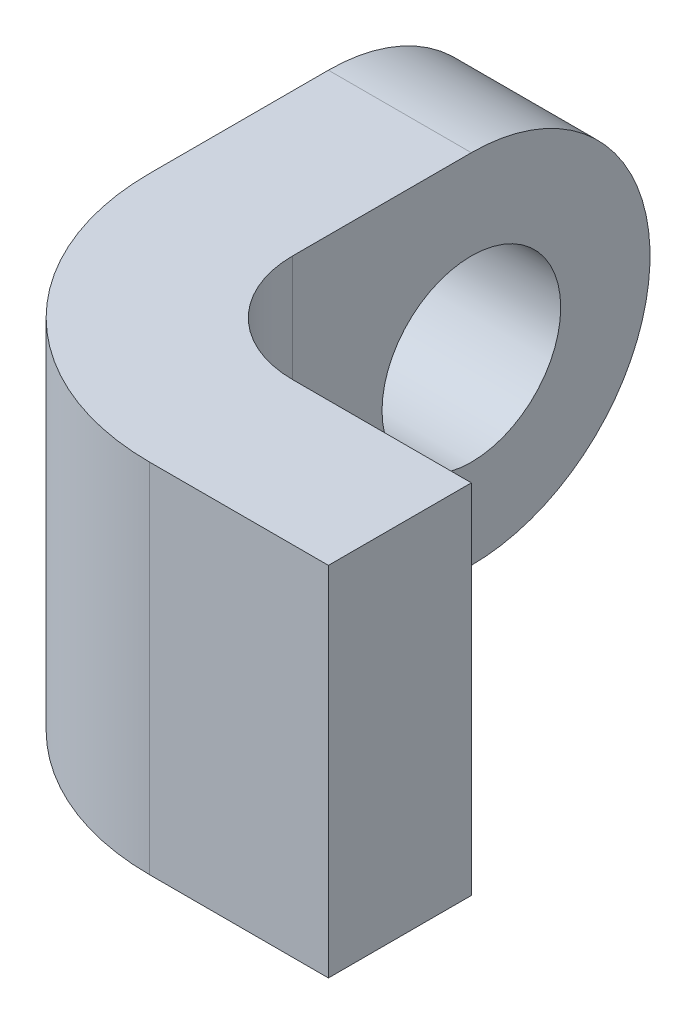
ISO-10303-21;
HEADER;
FILE_DESCRIPTION(('STEP AP214'),'2;1');
FILE_NAME('part.step','',(''),(''),'','','');
FILE_SCHEMA(('AUTOMOTIVE_DESIGN { 1 0 10303 214 1 1 1 1 }'));
ENDSEC;
DATA;
#1=APPLICATION_CONTEXT('core data for automotive mechanical design processes');
#2=APPLICATION_PROTOCOL_DEFINITION('international standard','automotive_design',2000,#1);
#3=PRODUCT_CONTEXT('',#1,'mechanical');
#4=PRODUCT('Part','Part','',(#3));
#5=PRODUCT_RELATED_PRODUCT_CATEGORY('part','',(#4));
#6=PRODUCT_DEFINITION_FORMATION('','',#4);
#7=PRODUCT_DEFINITION_CONTEXT('part definition',#1,'design');
#8=PRODUCT_DEFINITION('design','',#6,#7);
#9=PRODUCT_DEFINITION_SHAPE('','',#8);
#10=(LENGTH_UNIT() NAMED_UNIT(*) SI_UNIT(.MILLI.,.METRE.));
#11=(NAMED_UNIT(*) PLANE_ANGLE_UNIT() SI_UNIT($,.RADIAN.));
#12=(NAMED_UNIT(*) SI_UNIT($,.STERADIAN.) SOLID_ANGLE_UNIT());
#13=UNCERTAINTY_MEASURE_WITH_UNIT(LENGTH_MEASURE(1.E-05),#10,'distance_accuracy_value','');
#14=(GEOMETRIC_REPRESENTATION_CONTEXT(3) GLOBAL_UNCERTAINTY_ASSIGNED_CONTEXT((#13)) GLOBAL_UNIT_ASSIGNED_CONTEXT((#10,
#11,#12)) REPRESENTATION_CONTEXT('',''));
#15=CARTESIAN_POINT('',(0.,0.,0.));
#16=DIRECTION('',(0.,0.,1.));
#17=DIRECTION('',(1.,0.,0.));
#18=AXIS2_PLACEMENT_3D('',#15,#16,#17);
#19=CARTESIAN_POINT('',(-3.75,0.,-0.5));
#20=DIRECTION('',(1.,0.,0.));
#21=DIRECTION('',(0.,1.,0.));
#22=AXIS2_PLACEMENT_3D('',#19,#20,#21);
#23=PLANE('',#22);
#24=DIRECTION('',(0.,1.,0.));
#25=VECTOR('',#24,1.);
#26=CARTESIAN_POINT('',(-3.75,-0.5,-0.7));
#27=LINE('',#26,#25);
#28=CARTESIAN_POINT('',(-3.75,-0.5,-0.7));
#29=VERTEX_POINT('',#28);
#30=CARTESIAN_POINT('',(-3.75,0.5,-0.7));
#31=VERTEX_POINT('',#30);
#32=EDGE_CURVE('E11',#29,#31,#27,.T.);
#33=ORIENTED_EDGE('',*,*,#32,.T.);
#34=DIRECTION('',(0.,0.,1.));
#35=VECTOR('',#34,1.);
#36=CARTESIAN_POINT('',(-3.75,0.5,-0.7));
#37=LINE('',#36,#35);
#38=CARTESIAN_POINT('',(-3.75,0.5,-0.3));
#39=VERTEX_POINT('',#38);
#40=EDGE_CURVE('E180',#31,#39,#37,.T.);
#41=ORIENTED_EDGE('',*,*,#40,.T.);
#42=DIRECTION('',(0.,-1.,0.));
#43=VECTOR('',#42,1.);
#44=CARTESIAN_POINT('',(-3.75,0.5,-0.3));
#45=LINE('',#44,#43);
#46=CARTESIAN_POINT('',(-3.75,-0.5,-0.3));
#47=VERTEX_POINT('',#46);
#48=EDGE_CURVE('E27',#39,#47,#45,.T.);
#49=ORIENTED_EDGE('',*,*,#48,.T.);
#50=DIRECTION('',(0.,0.,-1.));
#51=VECTOR('',#50,1.);
#52=CARTESIAN_POINT('',(-3.75,-0.5,-0.3));
#53=LINE('',#52,#51);
#54=EDGE_CURVE('E196',#47,#29,#53,.T.);
#55=ORIENTED_EDGE('',*,*,#54,.T.);
#56=EDGE_LOOP('',(#33,#41,#49,#55));
#57=FACE_BOUND('',#56,.T.);
#58=ADVANCED_FACE('F16',(#57),#23,.T.);
#59=CARTESIAN_POINT('',(-3.75,-0.5,-0.7));
#60=DIRECTION('',(0.,0.,1.));
#61=DIRECTION('',(1.,0.,0.));
#62=AXIS2_PLACEMENT_3D('',#59,#60,#61);
#63=PLANE('',#62);
#64=ORIENTED_EDGE('',*,*,#32,.F.);
#65=DIRECTION('',(-1.,0.,0.));
#66=VECTOR('',#65,1.);
#67=CARTESIAN_POINT('',(-3.75,-0.5,-0.7));
#68=LINE('',#67,#66);
#69=CARTESIAN_POINT('',(-4.25,-0.5,-0.7));
#70=VERTEX_POINT('',#69);
#71=EDGE_CURVE('E193',#29,#70,#68,.T.);
#72=ORIENTED_EDGE('',*,*,#71,.T.);
#73=DIRECTION('',(0.,1.,0.));
#74=VECTOR('',#73,1.);
#75=CARTESIAN_POINT('',(-4.25,-0.5,-0.7));
#76=LINE('',#75,#74);
#77=CARTESIAN_POINT('',(-4.25,0.5,-0.7));
#78=VERTEX_POINT('',#77);
#79=EDGE_CURVE('E173',#70,#78,#76,.T.);
#80=ORIENTED_EDGE('',*,*,#79,.T.);
#81=DIRECTION('',(-1.,0.,0.));
#82=VECTOR('',#81,1.);
#83=CARTESIAN_POINT('',(-3.75,0.5,-0.7));
#84=LINE('',#83,#82);
#85=EDGE_CURVE('E162',#31,#78,#84,.T.);
#86=ORIENTED_EDGE('',*,*,#85,.F.);
#87=EDGE_LOOP('',(#64,#72,#80,#86));
#88=FACE_BOUND('',#87,.T.);
#89=ADVANCED_FACE('F238',(#88),#63,.F.);
#90=CARTESIAN_POINT('',(-3.75,0.5,-0.3));
#91=DIRECTION('',(0.,0.,-1.));
#92=DIRECTION('',(0.,-1.,0.));
#93=AXIS2_PLACEMENT_3D('',#90,#91,#92);
#94=PLANE('',#93);
#95=ORIENTED_EDGE('',*,*,#48,.F.);
#96=DIRECTION('',(-1.,0.,0.));
#97=VECTOR('',#96,1.);
#98=CARTESIAN_POINT('',(-3.75,0.5,-0.3));
#99=LINE('',#98,#97);
#100=CARTESIAN_POINT('',(-4.25,0.5,-0.3));
#101=VERTEX_POINT('',#100);
#102=EDGE_CURVE('E170',#39,#101,#99,.T.);
#103=ORIENTED_EDGE('',*,*,#102,.T.);
#104=DIRECTION('',(0.,-1.,0.));
#105=VECTOR('',#104,1.);
#106=CARTESIAN_POINT('',(-4.25,0.5,-0.3));
#107=LINE('',#106,#105);
#108=CARTESIAN_POINT('',(-4.25,-0.5,-0.3));
#109=VERTEX_POINT('',#108);
#110=EDGE_CURVE('E153',#101,#109,#107,.T.);
#111=ORIENTED_EDGE('',*,*,#110,.T.);
#112=DIRECTION('',(-1.,0.,0.));
#113=VECTOR('',#112,1.);
#114=CARTESIAN_POINT('',(-3.75,-0.5,-0.3));
#115=LINE('',#114,#113);
#116=EDGE_CURVE('E183',#47,#109,#115,.T.);
#117=ORIENTED_EDGE('',*,*,#116,.F.);
#118=EDGE_LOOP('',(#95,#103,#111,#117));
#119=FACE_BOUND('',#118,.T.);
#120=ADVANCED_FACE('F227',(#119),#94,.F.);
#121=CARTESIAN_POINT('',(-3.75,-0.5,-0.3));
#122=DIRECTION('',(0.,1.,0.));
#123=DIRECTION('',(1.,0.,0.));
#124=AXIS2_PLACEMENT_3D('',#121,#122,#123);
#125=PLANE('',#124);
#126=DIRECTION('',(1.,0.,0.));
#127=VECTOR('',#126,1.);
#128=CARTESIAN_POINT('',(-4.25,-0.5,-1.5));
#129=LINE('',#128,#127);
#130=CARTESIAN_POINT('',(-4.95,-0.5,-1.5));
#131=VERTEX_POINT('',#130);
#132=CARTESIAN_POINT('',(-4.55,-0.5,-1.5));
#133=VERTEX_POINT('',#132);
#134=EDGE_CURVE('E119',#131,#133,#129,.T.);
#135=ORIENTED_EDGE('',*,*,#134,.T.);
#136=DIRECTION('',(0.,0.,-1.));
#137=VECTOR('',#136,1.);
#138=CARTESIAN_POINT('',(-4.55,-0.5,-1.));
#139=LINE('',#138,#137);
#140=CARTESIAN_POINT('',(-4.55,-0.5,-1.));
#141=VERTEX_POINT('',#140);
#142=EDGE_CURVE('E156',#141,#133,#139,.T.);
#143=ORIENTED_EDGE('',*,*,#142,.F.);
#144=CARTESIAN_POINT('',(-4.25,-0.5,-1.));
#145=DIRECTION('',(0.,-1.,0.));
#146=DIRECTION('',(0.,0.,1.));
#147=AXIS2_PLACEMENT_3D('',#144,#145,#146);
#148=CIRCLE('',#147,0.3);
#149=EDGE_CURVE('E197',#70,#141,#148,.T.);
#150=ORIENTED_EDGE('',*,*,#149,.F.);
#151=ORIENTED_EDGE('',*,*,#71,.F.);
#152=ORIENTED_EDGE('',*,*,#54,.F.);
#153=ORIENTED_EDGE('',*,*,#116,.T.);
#154=CARTESIAN_POINT('',(-4.25,-0.5,-1.));
#155=DIRECTION('',(0.,-1.,0.));
#156=DIRECTION('',(0.,0.,1.));
#157=AXIS2_PLACEMENT_3D('',#154,#155,#156);
#158=CIRCLE('',#157,0.7);
#159=CARTESIAN_POINT('',(-4.95,-0.5,-1.));
#160=VERTEX_POINT('',#159);
#161=EDGE_CURVE('E110',#109,#160,#158,.T.);
#162=ORIENTED_EDGE('',*,*,#161,.T.);
#163=DIRECTION('',(0.,0.,-1.));
#164=VECTOR('',#163,1.);
#165=CARTESIAN_POINT('',(-4.95,-0.5,-1.));
#166=LINE('',#165,#164);
#167=EDGE_CURVE('E131',#160,#131,#166,.T.);
#168=ORIENTED_EDGE('',*,*,#167,.T.);
#169=EDGE_LOOP('',(#135,#143,#150,#151,#152,#153,#162,#168));
#170=FACE_BOUND('',#169,.T.);
#171=ADVANCED_FACE('F132',(#170),#125,.F.);
#172=CARTESIAN_POINT('',(-4.25,0.,-1.));
#173=DIRECTION('',(0.,-1.,0.));
#174=DIRECTION('',(0.,0.,1.));
#175=AXIS2_PLACEMENT_3D('',#172,#173,#174);
#176=CYLINDRICAL_SURFACE('',#175,0.3);
#177=ORIENTED_EDGE('',*,*,#79,.F.);
#178=ORIENTED_EDGE('',*,*,#149,.T.);
#179=DIRECTION('',(0.,1.,0.));
#180=VECTOR('',#179,1.);
#181=CARTESIAN_POINT('',(-4.55,-0.5,-1.));
#182=LINE('',#181,#180);
#183=CARTESIAN_POINT('',(-4.55,0.5,-1.));
#184=VERTEX_POINT('',#183);
#185=EDGE_CURVE('E174',#141,#184,#182,.T.);
#186=ORIENTED_EDGE('',*,*,#185,.T.);
#187=CARTESIAN_POINT('',(-4.25,0.5,-1.));
#188=DIRECTION('',(0.,-1.,0.));
#189=DIRECTION('',(0.,0.,1.));
#190=AXIS2_PLACEMENT_3D('',#187,#188,#189);
#191=CIRCLE('',#190,0.3);
#192=EDGE_CURVE('E157',#78,#184,#191,.T.);
#193=ORIENTED_EDGE('',*,*,#192,.F.);
#194=EDGE_LOOP('',(#177,#178,#186,#193));
#195=FACE_BOUND('',#194,.T.);
#196=ADVANCED_FACE('F290',(#195),#176,.F.);
#197=CARTESIAN_POINT('',(-4.25,0.,-1.));
#198=DIRECTION('',(0.,-1.,0.));
#199=DIRECTION('',(0.,0.,1.));
#200=AXIS2_PLACEMENT_3D('',#197,#198,#199);
#201=CYLINDRICAL_SURFACE('',#200,0.7);
#202=ORIENTED_EDGE('',*,*,#110,.F.);
#203=CARTESIAN_POINT('',(-4.25,0.5,-1.));
#204=DIRECTION('',(0.,-1.,0.));
#205=DIRECTION('',(0.,0.,1.));
#206=AXIS2_PLACEMENT_3D('',#203,#204,#205);
#207=CIRCLE('',#206,0.7);
#208=CARTESIAN_POINT('',(-4.95,0.5,-1.));
#209=VERTEX_POINT('',#208);
#210=EDGE_CURVE('E128',#101,#209,#207,.T.);
#211=ORIENTED_EDGE('',*,*,#210,.T.);
#212=DIRECTION('',(0.,-1.,0.));
#213=VECTOR('',#212,1.);
#214=CARTESIAN_POINT('',(-4.95,0.5,-1.));
#215=LINE('',#214,#213);
#216=EDGE_CURVE('E136',#209,#160,#215,.T.);
#217=ORIENTED_EDGE('',*,*,#216,.T.);
#218=ORIENTED_EDGE('',*,*,#161,.F.);
#219=EDGE_LOOP('',(#202,#211,#217,#218));
#220=FACE_BOUND('',#219,.T.);
#221=ADVANCED_FACE('F226',(#220),#201,.T.);
#222=CARTESIAN_POINT('',(-4.55,-0.5,-1.));
#223=DIRECTION('',(-1.,0.,0.));
#224=DIRECTION('',(0.,0.,1.));
#225=AXIS2_PLACEMENT_3D('',#222,#223,#224);
#226=PLANE('',#225);
#227=CARTESIAN_POINT('',(-4.55,0.,-1.5));
#228=DIRECTION('',(-1.,0.,0.));
#229=DIRECTION('',(0.,0.,-1.));
#230=AXIS2_PLACEMENT_3D('',#227,#228,#229);
#231=CIRCLE('',#230,0.25);
#232=CARTESIAN_POINT('',(-4.55,0.,-1.25));
#233=VERTEX_POINT('',#232);
#234=EDGE_CURVE('E142',#233,#233,#231,.T.);
#235=ORIENTED_EDGE('',*,*,#234,.T.);
#236=EDGE_LOOP('',(#235));
#237=FACE_BOUND('',#236,.T.);
#238=CARTESIAN_POINT('',(-4.55,0.,-1.5));
#239=DIRECTION('',(1.,0.,0.));
#240=DIRECTION('',(0.,0.707106781186548,-0.707106781186547));
#241=AXIS2_PLACEMENT_3D('',#238,#239,#240);
#242=CIRCLE('',#241,0.5);
#243=CARTESIAN_POINT('',(-4.55,0.5,-1.5));
#244=VERTEX_POINT('',#243);
#245=EDGE_CURVE('E125',#133,#244,#242,.T.);
#246=ORIENTED_EDGE('',*,*,#245,.T.);
#247=DIRECTION('',(0.,0.,-1.));
#248=VECTOR('',#247,1.);
#249=CARTESIAN_POINT('',(-4.55,0.5,-1.));
#250=LINE('',#249,#248);
#251=EDGE_CURVE('E161',#184,#244,#250,.T.);
#252=ORIENTED_EDGE('',*,*,#251,.F.);
#253=ORIENTED_EDGE('',*,*,#185,.F.);
#254=ORIENTED_EDGE('',*,*,#142,.T.);
#255=EDGE_LOOP('',(#246,#252,#253,#254));
#256=FACE_BOUND('',#255,.T.);
#257=ADVANCED_FACE('F274',(#237,#256),#226,.F.);
#258=CARTESIAN_POINT('',(-3.75,0.5,-0.7));
#259=DIRECTION('',(0.,-1.,0.));
#260=DIRECTION('',(0.,0.,-1.));
#261=AXIS2_PLACEMENT_3D('',#258,#259,#260);
#262=PLANE('',#261);
#263=DIRECTION('',(-1.,0.,0.));
#264=VECTOR('',#263,1.);
#265=CARTESIAN_POINT('',(-4.25,0.5,-1.5));
#266=LINE('',#265,#264);
#267=CARTESIAN_POINT('',(-4.95,0.5,-1.5));
#268=VERTEX_POINT('',#267);
#269=EDGE_CURVE('E20',#244,#268,#266,.T.);
#270=ORIENTED_EDGE('',*,*,#269,.T.);
#271=DIRECTION('',(0.,0.,-1.));
#272=VECTOR('',#271,1.);
#273=CARTESIAN_POINT('',(-4.95,0.5,-1.));
#274=LINE('',#273,#272);
#275=EDGE_CURVE('E140',#209,#268,#274,.T.);
#276=ORIENTED_EDGE('',*,*,#275,.F.);
#277=ORIENTED_EDGE('',*,*,#210,.F.);
#278=ORIENTED_EDGE('',*,*,#102,.F.);
#279=ORIENTED_EDGE('',*,*,#40,.F.);
#280=ORIENTED_EDGE('',*,*,#85,.T.);
#281=ORIENTED_EDGE('',*,*,#192,.T.);
#282=ORIENTED_EDGE('',*,*,#251,.T.);
#283=EDGE_LOOP('',(#270,#276,#277,#278,#279,#280,#281,#282));
#284=FACE_BOUND('',#283,.T.);
#285=ADVANCED_FACE('F232',(#284),#262,.F.);
#286=CARTESIAN_POINT('',(-4.25,0.,-1.5));
#287=DIRECTION('',(1.,0.,0.));
#288=DIRECTION('',(0.,0.707106781186548,-0.707106781186547));
#289=AXIS2_PLACEMENT_3D('',#286,#287,#288);
#290=CYLINDRICAL_SURFACE('',#289,0.5);
#291=CARTESIAN_POINT('',(-4.95,0.,-1.5));
#292=DIRECTION('',(-1.,0.,0.));
#293=DIRECTION('',(0.,-0.707106781186548,-0.707106781186547));
#294=AXIS2_PLACEMENT_3D('',#291,#292,#293);
#295=CIRCLE('',#294,0.5);
#296=EDGE_CURVE('E123',#268,#131,#295,.T.);
#297=ORIENTED_EDGE('',*,*,#296,.F.);
#298=ORIENTED_EDGE('',*,*,#269,.F.);
#299=ORIENTED_EDGE('',*,*,#245,.F.);
#300=ORIENTED_EDGE('',*,*,#134,.F.);
#301=EDGE_LOOP('',(#297,#298,#299,#300));
#302=FACE_BOUND('',#301,.T.);
#303=ADVANCED_FACE('F120',(#302),#290,.T.);
#304=CARTESIAN_POINT('',(-4.95,0.5,-1.));
#305=DIRECTION('',(1.,0.,0.));
#306=DIRECTION('',(0.,1.,0.));
#307=AXIS2_PLACEMENT_3D('',#304,#305,#306);
#308=PLANE('',#307);
#309=CARTESIAN_POINT('',(-4.95,0.,-1.5));
#310=DIRECTION('',(1.,0.,0.));
#311=DIRECTION('',(0.,0.,-1.));
#312=AXIS2_PLACEMENT_3D('',#309,#310,#311);
#313=CIRCLE('',#312,0.25);
#314=CARTESIAN_POINT('',(-4.95,0.,-1.75));
#315=VERTEX_POINT('',#314);
#316=CARTESIAN_POINT('',(-4.95,0.,-1.25));
#317=VERTEX_POINT('',#316);
#318=EDGE_CURVE('E163',#315,#317,#313,.T.);
#319=ORIENTED_EDGE('',*,*,#318,.T.);
#320=CARTESIAN_POINT('',(-4.95,0.,-1.5));
#321=DIRECTION('',(1.,0.,0.));
#322=DIRECTION('',(0.,0.,-1.));
#323=AXIS2_PLACEMENT_3D('',#320,#321,#322);
#324=CIRCLE('',#323,0.25);
#325=EDGE_CURVE('E167',#317,#315,#324,.T.);
#326=ORIENTED_EDGE('',*,*,#325,.T.);
#327=EDGE_LOOP('',(#319,#326));
#328=FACE_BOUND('',#327,.T.);
#329=ORIENTED_EDGE('',*,*,#296,.T.);
#330=ORIENTED_EDGE('',*,*,#167,.F.);
#331=ORIENTED_EDGE('',*,*,#216,.F.);
#332=ORIENTED_EDGE('',*,*,#275,.T.);
#333=EDGE_LOOP('',(#329,#330,#331,#332));
#334=FACE_BOUND('',#333,.T.);
#335=ADVANCED_FACE('F18',(#328,#334),#308,.F.);
#336=CARTESIAN_POINT('',(-4.95,0.,-1.5));
#337=DIRECTION('',(-1.,0.,0.));
#338=DIRECTION('',(0.,0.,-1.));
#339=AXIS2_PLACEMENT_3D('',#336,#337,#338);
#340=CYLINDRICAL_SURFACE('',#339,0.25);
#341=ORIENTED_EDGE('',*,*,#318,.F.);
#342=ORIENTED_EDGE('',*,*,#325,.F.);
#343=DIRECTION('',(1.,0.,0.));
#344=VECTOR('',#343,1.);
#345=CARTESIAN_POINT('',(-4.95,0.,-1.25));
#346=LINE('',#345,#344);
#347=EDGE_CURVE('E148',#317,#233,#346,.T.);
#348=ORIENTED_EDGE('',*,*,#347,.T.);
#349=ORIENTED_EDGE('',*,*,#234,.F.);
#350=ORIENTED_EDGE('',*,*,#347,.F.);
#351=EDGE_LOOP('',(#341,#342,#348,#349,#350));
#352=FACE_BOUND('',#351,.T.);
#353=ADVANCED_FACE('F262',(#352),#340,.F.);
#354=CLOSED_SHELL('',(#58,#89,#120,#171,#196,#221,#257,#285,#303,#335,#353));
#355=MANIFOLD_SOLID_BREP('B1',#354);
#356=ADVANCED_BREP_SHAPE_REPRESENTATION('',(#18,#355),#14);
#357=SHAPE_DEFINITION_REPRESENTATION(#9,#356);
ENDSEC;
END-ISO-10303-21;
